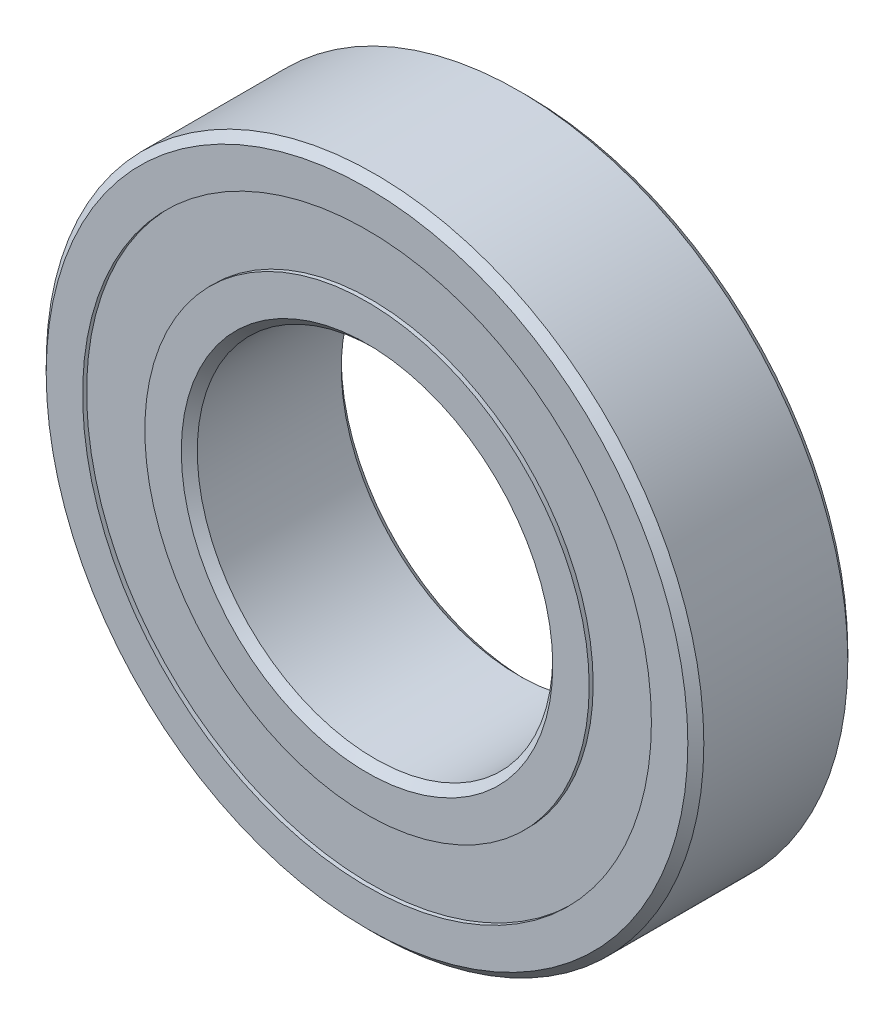
ISO-10303-21;
HEADER;
FILE_DESCRIPTION(('STEP AP214'),'2;1');
FILE_NAME('part.step','',(''),(''),'','','');
FILE_SCHEMA(('AUTOMOTIVE_DESIGN { 1 0 10303 214 1 1 1 1 }'));
ENDSEC;
DATA;
#1=APPLICATION_CONTEXT('core data for automotive mechanical design processes');
#2=APPLICATION_PROTOCOL_DEFINITION('international standard','automotive_design',2000,#1);
#3=PRODUCT_CONTEXT('',#1,'mechanical');
#4=PRODUCT('Part','Part','',(#3));
#5=PRODUCT_RELATED_PRODUCT_CATEGORY('part','',(#4));
#6=PRODUCT_DEFINITION_FORMATION('','',#4);
#7=PRODUCT_DEFINITION_CONTEXT('part definition',#1,'design');
#8=PRODUCT_DEFINITION('design','',#6,#7);
#9=PRODUCT_DEFINITION_SHAPE('','',#8);
#10=(LENGTH_UNIT() NAMED_UNIT(*) SI_UNIT(.MILLI.,.METRE.));
#11=(NAMED_UNIT(*) PLANE_ANGLE_UNIT() SI_UNIT($,.RADIAN.));
#12=(NAMED_UNIT(*) SI_UNIT($,.STERADIAN.) SOLID_ANGLE_UNIT());
#13=UNCERTAINTY_MEASURE_WITH_UNIT(LENGTH_MEASURE(1.E-05),#10,'distance_accuracy_value','');
#14=(GEOMETRIC_REPRESENTATION_CONTEXT(3) GLOBAL_UNCERTAINTY_ASSIGNED_CONTEXT((#13)) GLOBAL_UNIT_ASSIGNED_CONTEXT((#10,
#11,#12)) REPRESENTATION_CONTEXT('',''));
#15=CARTESIAN_POINT('',(0.,0.,0.));
#16=DIRECTION('',(0.,0.,1.));
#17=DIRECTION('',(1.,0.,0.));
#18=AXIS2_PLACEMENT_3D('',#15,#16,#17);
#19=CARTESIAN_POINT('',(0.,16.,-4.275));
#20=DIRECTION('',(0.,0.,1.));
#21=DIRECTION('',(1.,0.,0.));
#22=AXIS2_PLACEMENT_3D('',#19,#20,#21);
#23=PLANE('',#22);
#24=CARTESIAN_POINT('',(0.,0.,-4.275));
#25=DIRECTION('',(0.,0.,1.));
#26=DIRECTION('',(1.,0.,0.));
#27=AXIS2_PLACEMENT_3D('',#24,#25,#26);
#28=CIRCLE('',#27,16.);
#29=CARTESIAN_POINT('',(16.,0.,-4.275));
#30=VERTEX_POINT('',#29);
#31=EDGE_CURVE('E59',#30,#30,#28,.T.);
#32=ORIENTED_EDGE('',*,*,#31,.F.);
#33=EDGE_LOOP('',(#32));
#34=FACE_BOUND('',#33,.T.);
#35=CARTESIAN_POINT('',(0.,0.,-4.275));
#36=DIRECTION('',(0.,0.,1.));
#37=DIRECTION('',(1.,0.,0.));
#38=AXIS2_PLACEMENT_3D('',#35,#36,#37);
#39=CIRCLE('',#38,12.5);
#40=CARTESIAN_POINT('',(12.5,0.,-4.275));
#41=VERTEX_POINT('',#40);
#42=EDGE_CURVE('E11',#41,#41,#39,.T.);
#43=ORIENTED_EDGE('',*,*,#42,.T.);
#44=EDGE_LOOP('',(#43));
#45=FACE_BOUND('',#44,.T.);
#46=ADVANCED_FACE('F45',(#34,#45),#23,.F.);
#47=CARTESIAN_POINT('',(0.,0.,4.5));
#48=DIRECTION('',(0.,0.,1.));
#49=DIRECTION('',(1.,0.,0.));
#50=AXIS2_PLACEMENT_3D('',#47,#48,#49);
#51=CYLINDRICAL_SURFACE('',#50,12.5);
#52=ORIENTED_EDGE('',*,*,#42,.F.);
#53=EDGE_LOOP('',(#52));
#54=FACE_BOUND('',#53,.T.);
#55=CARTESIAN_POINT('',(0.,0.,-2.65753645318366));
#56=DIRECTION('',(0.,0.,1.));
#57=DIRECTION('',(1.,0.,0.));
#58=AXIS2_PLACEMENT_3D('',#55,#56,#57);
#59=CIRCLE('',#58,12.5);
#60=CARTESIAN_POINT('',(12.5,0.,-2.65753645318366));
#61=VERTEX_POINT('',#60);
#62=EDGE_CURVE('E51',#61,#61,#59,.T.);
#63=ORIENTED_EDGE('',*,*,#62,.T.);
#64=EDGE_LOOP('',(#63));
#65=FACE_BOUND('',#64,.T.);
#66=ADVANCED_FACE('F68',(#54,#65),#51,.F.);
#67=CARTESIAN_POINT('',(0.,16.,-2.65753645318366));
#68=DIRECTION('',(0.,0.,-1.));
#69=DIRECTION('',(-1.,0.,0.));
#70=AXIS2_PLACEMENT_3D('',#67,#68,#69);
#71=PLANE('',#70);
#72=ORIENTED_EDGE('',*,*,#62,.F.);
#73=EDGE_LOOP('',(#72));
#74=FACE_BOUND('',#73,.T.);
#75=CARTESIAN_POINT('',(0.,0.,-2.65753645318366));
#76=DIRECTION('',(0.,0.,1.));
#77=DIRECTION('',(1.,0.,0.));
#78=AXIS2_PLACEMENT_3D('',#75,#76,#77);
#79=CIRCLE('',#78,16.);
#80=CARTESIAN_POINT('',(16.,0.,-2.65753645318366));
#81=VERTEX_POINT('',#80);
#82=EDGE_CURVE('E55',#81,#81,#79,.T.);
#83=ORIENTED_EDGE('',*,*,#82,.T.);
#84=EDGE_LOOP('',(#83));
#85=FACE_BOUND('',#84,.T.);
#86=ADVANCED_FACE('F72',(#74,#85),#71,.F.);
#87=CARTESIAN_POINT('',(0.,0.,4.5));
#88=DIRECTION('',(0.,0.,1.));
#89=DIRECTION('',(1.,0.,0.));
#90=AXIS2_PLACEMENT_3D('',#87,#88,#89);
#91=CYLINDRICAL_SURFACE('',#90,16.);
#92=ORIENTED_EDGE('',*,*,#82,.F.);
#93=EDGE_LOOP('',(#92));
#94=FACE_BOUND('',#93,.T.);
#95=ORIENTED_EDGE('',*,*,#31,.T.);
#96=EDGE_LOOP('',(#95));
#97=FACE_BOUND('',#96,.T.);
#98=ADVANCED_FACE('F65',(#94,#97),#91,.T.);
#99=CLOSED_SHELL('',(#46,#66,#86,#98));
#100=MANIFOLD_SOLID_BREP('B2',#99);
#101=CARTESIAN_POINT('',(0.,16.,4.275));
#102=DIRECTION('',(0.,0.,-1.));
#103=DIRECTION('',(-1.,0.,0.));
#104=AXIS2_PLACEMENT_3D('',#101,#102,#103);
#105=PLANE('',#104);
#106=CARTESIAN_POINT('',(0.,0.,4.275));
#107=DIRECTION('',(0.,0.,1.));
#108=DIRECTION('',(1.,0.,0.));
#109=AXIS2_PLACEMENT_3D('',#106,#107,#108);
#110=CIRCLE('',#109,12.5);
#111=CARTESIAN_POINT('',(12.5,0.,4.275));
#112=VERTEX_POINT('',#111);
#113=EDGE_CURVE('E44',#112,#112,#110,.T.);
#114=ORIENTED_EDGE('',*,*,#113,.F.);
#115=EDGE_LOOP('',(#114));
#116=FACE_BOUND('',#115,.T.);
#117=CARTESIAN_POINT('',(0.,0.,4.275));
#118=DIRECTION('',(0.,0.,1.));
#119=DIRECTION('',(1.,0.,0.));
#120=AXIS2_PLACEMENT_3D('',#117,#118,#119);
#121=CIRCLE('',#120,16.);
#122=CARTESIAN_POINT('',(16.,0.,4.275));
#123=VERTEX_POINT('',#122);
#124=EDGE_CURVE('E126',#123,#123,#121,.T.);
#125=ORIENTED_EDGE('',*,*,#124,.T.);
#126=EDGE_LOOP('',(#125));
#127=FACE_BOUND('',#126,.T.);
#128=ADVANCED_FACE('F112',(#116,#127),#105,.F.);
#129=CARTESIAN_POINT('',(0.,0.,4.5));
#130=DIRECTION('',(0.,0.,1.));
#131=DIRECTION('',(1.,0.,0.));
#132=AXIS2_PLACEMENT_3D('',#129,#130,#131);
#133=CYLINDRICAL_SURFACE('',#132,12.5);
#134=CARTESIAN_POINT('',(0.,0.,2.65753645318366));
#135=DIRECTION('',(0.,0.,1.));
#136=DIRECTION('',(1.,0.,0.));
#137=AXIS2_PLACEMENT_3D('',#134,#135,#136);
#138=CIRCLE('',#137,12.5);
#139=CARTESIAN_POINT('',(12.5,0.,2.65753645318366));
#140=VERTEX_POINT('',#139);
#141=EDGE_CURVE('E118',#140,#140,#138,.T.);
#142=ORIENTED_EDGE('',*,*,#141,.F.);
#143=EDGE_LOOP('',(#142));
#144=FACE_BOUND('',#143,.T.);
#145=ORIENTED_EDGE('',*,*,#113,.T.);
#146=EDGE_LOOP('',(#145));
#147=FACE_BOUND('',#146,.T.);
#148=ADVANCED_FACE('F141',(#144,#147),#133,.F.);
#149=CARTESIAN_POINT('',(0.,16.,2.65753645318366));
#150=DIRECTION('',(0.,0.,1.));
#151=DIRECTION('',(1.,0.,0.));
#152=AXIS2_PLACEMENT_3D('',#149,#150,#151);
#153=PLANE('',#152);
#154=CARTESIAN_POINT('',(0.,0.,2.65753645318366));
#155=DIRECTION('',(0.,0.,1.));
#156=DIRECTION('',(1.,0.,0.));
#157=AXIS2_PLACEMENT_3D('',#154,#155,#156);
#158=CIRCLE('',#157,16.);
#159=CARTESIAN_POINT('',(16.,0.,2.65753645318366));
#160=VERTEX_POINT('',#159);
#161=EDGE_CURVE('E122',#160,#160,#158,.T.);
#162=ORIENTED_EDGE('',*,*,#161,.F.);
#163=EDGE_LOOP('',(#162));
#164=FACE_BOUND('',#163,.T.);
#165=ORIENTED_EDGE('',*,*,#141,.T.);
#166=EDGE_LOOP('',(#165));
#167=FACE_BOUND('',#166,.T.);
#168=ADVANCED_FACE('F136',(#164,#167),#153,.F.);
#169=CARTESIAN_POINT('',(0.,0.,4.5));
#170=DIRECTION('',(0.,0.,1.));
#171=DIRECTION('',(1.,0.,0.));
#172=AXIS2_PLACEMENT_3D('',#169,#170,#171);
#173=CYLINDRICAL_SURFACE('',#172,16.);
#174=ORIENTED_EDGE('',*,*,#124,.F.);
#175=EDGE_LOOP('',(#174));
#176=FACE_BOUND('',#175,.T.);
#177=ORIENTED_EDGE('',*,*,#161,.T.);
#178=EDGE_LOOP('',(#177));
#179=FACE_BOUND('',#178,.T.);
#180=ADVANCED_FACE('F133',(#176,#179),#173,.T.);
#181=CLOSED_SHELL('',(#128,#148,#168,#180));
#182=MANIFOLD_SOLID_BREP('B6',#181);
#183=CARTESIAN_POINT('',(-7.7041316487421,11.9878628428444,0.));
#184=DIRECTION('',(0.,0.,1.));
#185=DIRECTION('',(-0.540640817455586,0.841253532831188,0.));
#186=AXIS2_PLACEMENT_3D('',#183,#184,#185);
#187=SPHERICAL_SURFACE('',#186,2.65753645318366);
#188=CARTESIAN_POINT('',(-7.7041316487421,11.9878628428444,2.65753645318366));
#189=VERTEX_POINT('',#188);
#190=VERTEX_LOOP('',#189);
#191=FACE_BOUND('',#190,.T.);
#192=ADVANCED_FACE('F179',(#191),#187,.T.);
#193=CLOSED_SHELL('',(#192));
#194=MANIFOLD_SOLID_BREP('B39',#193);
#195=CARTESIAN_POINT('',(-12.9622559338018,5.91966393527704,0.));
#196=DIRECTION('',(0.,0.,1.));
#197=DIRECTION('',(-0.909631995354513,0.415415013001897,0.));
#198=AXIS2_PLACEMENT_3D('',#195,#196,#197);
#199=SPHERICAL_SURFACE('',#198,2.65753645318366);
#200=CARTESIAN_POINT('',(-12.9622559338018,5.91966393527704,2.65753645318366));
#201=VERTEX_POINT('',#200);
#202=VERTEX_LOOP('',#201);
#203=FACE_BOUND('',#202,.T.);
#204=ADVANCED_FACE('F199',(#203),#199,.T.);
#205=CLOSED_SHELL('',(#204));
#206=MANIFOLD_SOLID_BREP('B108',#205);
#207=CARTESIAN_POINT('',(-14.1049555468033,-2.02798644539416,0.));
#208=DIRECTION('',(0.,0.,1.));
#209=DIRECTION('',(-0.989821441880934,-0.142314838273275,0.));
#210=AXIS2_PLACEMENT_3D('',#207,#208,#209);
#211=SPHERICAL_SURFACE('',#210,2.65753645318366);
#212=CARTESIAN_POINT('',(-14.1049555468033,-2.02798644539416,2.65753645318366));
#213=VERTEX_POINT('',#212);
#214=VERTEX_LOOP('',#213);
#215=FACE_BOUND('',#214,.T.);
#216=ADVANCED_FACE('F219',(#215),#211,.T.);
#217=CLOSED_SHELL('',(#216));
#218=MANIFOLD_SOLID_BREP('B175',#217);
#219=CARTESIAN_POINT('',(-10.7694314345483,-9.33176545872021,0.));
#220=DIRECTION('',(0.,0.,1.));
#221=DIRECTION('',(-0.755749574354264,-0.654860733945278,0.));
#222=AXIS2_PLACEMENT_3D('',#219,#220,#221);
#223=SPHERICAL_SURFACE('',#222,2.65753645318366);
#224=CARTESIAN_POINT('',(-10.7694314345483,-9.33176545872021,2.65753645318366));
#225=VERTEX_POINT('',#224);
#226=VERTEX_LOOP('',#225);
#227=FACE_BOUND('',#226,.T.);
#228=ADVANCED_FACE('F239',(#227),#223,.T.);
#229=CLOSED_SHELL('',(#228));
#230=MANIFOLD_SOLID_BREP('B195',#229);
#231=CARTESIAN_POINT('',(-4.01468893499048,-13.6727748740066,0.));
#232=DIRECTION('',(0.,0.,1.));
#233=DIRECTION('',(-0.281732556841437,-0.959492973614495,0.));
#234=AXIS2_PLACEMENT_3D('',#231,#232,#233);
#235=SPHERICAL_SURFACE('',#234,2.65753645318366);
#236=CARTESIAN_POINT('',(-4.01468893499048,-13.6727748740066,2.65753645318366));
#237=VERTEX_POINT('',#236);
#238=VERTEX_LOOP('',#237);
#239=FACE_BOUND('',#238,.T.);
#240=ADVANCED_FACE('F259',(#239),#235,.T.);
#241=CLOSED_SHELL('',(#240));
#242=MANIFOLD_SOLID_BREP('B215',#241);
#243=CARTESIAN_POINT('',(4.01468893499028,-13.6727748740066,0.));
#244=DIRECTION('',(0.,0.,1.));
#245=DIRECTION('',(0.281732556841423,-0.959492973614499,0.));
#246=AXIS2_PLACEMENT_3D('',#243,#244,#245);
#247=SPHERICAL_SURFACE('',#246,2.65753645318366);
#248=CARTESIAN_POINT('',(4.01468893499028,-13.6727748740066,2.65753645318366));
#249=VERTEX_POINT('',#248);
#250=VERTEX_LOOP('',#249);
#251=FACE_BOUND('',#250,.T.);
#252=ADVANCED_FACE('F279',(#251),#247,.T.);
#253=CLOSED_SHELL('',(#252));
#254=MANIFOLD_SOLID_BREP('B235',#253);
#255=CARTESIAN_POINT('',(10.7694314345481,-9.33176545872037,0.));
#256=DIRECTION('',(0.,0.,1.));
#257=DIRECTION('',(0.755749574354255,-0.654860733945289,0.));
#258=AXIS2_PLACEMENT_3D('',#255,#256,#257);
#259=SPHERICAL_SURFACE('',#258,2.65753645318366);
#260=CARTESIAN_POINT('',(10.7694314345481,-9.33176545872037,2.65753645318366));
#261=VERTEX_POINT('',#260);
#262=VERTEX_LOOP('',#261);
#263=FACE_BOUND('',#262,.T.);
#264=ADVANCED_FACE('F299',(#263),#259,.T.);
#265=CLOSED_SHELL('',(#264));
#266=MANIFOLD_SOLID_BREP('B255',#265);
#267=CARTESIAN_POINT('',(14.1049555468033,-2.02798644539437,0.));
#268=DIRECTION('',(0.,0.,1.));
#269=DIRECTION('',(0.989821441880932,-0.142314838273289,0.));
#270=AXIS2_PLACEMENT_3D('',#267,#268,#269);
#271=SPHERICAL_SURFACE('',#270,2.65753645318366);
#272=CARTESIAN_POINT('',(14.1049555468033,-2.02798644539437,2.65753645318366));
#273=VERTEX_POINT('',#272);
#274=VERTEX_LOOP('',#273);
#275=FACE_BOUND('',#274,.T.);
#276=ADVANCED_FACE('F319',(#275),#271,.T.);
#277=CLOSED_SHELL('',(#276));
#278=MANIFOLD_SOLID_BREP('B275',#277);
#279=CARTESIAN_POINT('',(12.9622559338019,5.91966393527685,0.));
#280=DIRECTION('',(0.,0.,1.));
#281=DIRECTION('',(0.909631995354519,0.415415013001884,0.));
#282=AXIS2_PLACEMENT_3D('',#279,#280,#281);
#283=SPHERICAL_SURFACE('',#282,2.65753645318366);
#284=CARTESIAN_POINT('',(12.9622559338019,5.91966393527685,2.65753645318366));
#285=VERTEX_POINT('',#284);
#286=VERTEX_LOOP('',#285);
#287=FACE_BOUND('',#286,.T.);
#288=ADVANCED_FACE('F339',(#287),#283,.T.);
#289=CLOSED_SHELL('',(#288));
#290=MANIFOLD_SOLID_BREP('B295',#289);
#291=CARTESIAN_POINT('',(7.70413164874228,11.9878628428443,0.));
#292=DIRECTION('',(0.,0.,1.));
#293=DIRECTION('',(0.540640817455599,0.841253532831181,0.));
#294=AXIS2_PLACEMENT_3D('',#291,#292,#293);
#295=SPHERICAL_SURFACE('',#294,2.65753645318366);
#296=CARTESIAN_POINT('',(7.70413164874228,11.9878628428443,2.65753645318366));
#297=VERTEX_POINT('',#296);
#298=VERTEX_LOOP('',#297);
#299=FACE_BOUND('',#298,.T.);
#300=ADVANCED_FACE('F359',(#299),#295,.T.);
#301=CLOSED_SHELL('',(#300));
#302=MANIFOLD_SOLID_BREP('B315',#301);
#303=CARTESIAN_POINT('',(0.,14.25,0.));
#304=DIRECTION('',(0.,0.,1.));
#305=DIRECTION('',(0.,1.,0.));
#306=AXIS2_PLACEMENT_3D('',#303,#304,#305);
#307=SPHERICAL_SURFACE('',#306,2.65753645318366);
#308=CARTESIAN_POINT('',(0.,14.25,2.65753645318366));
#309=VERTEX_POINT('',#308);
#310=VERTEX_LOOP('',#309);
#311=FACE_BOUND('',#310,.T.);
#312=ADVANCED_FACE('F381',(#311),#307,.T.);
#313=CLOSED_SHELL('',(#312));
#314=MANIFOLD_SOLID_BREP('B335',#313);
#315=CARTESIAN_POINT('',(0.,0.,4.5));
#316=DIRECTION('',(0.,0.,1.));
#317=DIRECTION('',(1.,0.,0.));
#318=AXIS2_PLACEMENT_3D('',#315,#316,#317);
#319=CONICAL_SURFACE('',#318,10.45,0.785398163397449);
#320=CARTESIAN_POINT('',(0.,0.,4.05));
#321=DIRECTION('',(0.,0.,1.));
#322=DIRECTION('',(1.,0.,0.));
#323=AXIS2_PLACEMENT_3D('',#320,#321,#322);
#324=CIRCLE('',#323,10.);
#325=CARTESIAN_POINT('',(10.,0.,4.05));
#326=VERTEX_POINT('',#325);
#327=EDGE_CURVE('E380',#326,#326,#324,.T.);
#328=ORIENTED_EDGE('',*,*,#327,.F.);
#329=EDGE_LOOP('',(#328));
#330=FACE_BOUND('',#329,.T.);
#331=CARTESIAN_POINT('',(0.,0.,4.5));
#332=DIRECTION('',(0.,0.,1.));
#333=DIRECTION('',(1.,0.,0.));
#334=AXIS2_PLACEMENT_3D('',#331,#332,#333);
#335=CIRCLE('',#334,10.45);
#336=CARTESIAN_POINT('',(10.45,0.,4.5));
#337=VERTEX_POINT('',#336);
#338=EDGE_CURVE('E428',#337,#337,#335,.T.);
#339=ORIENTED_EDGE('',*,*,#338,.T.);
#340=EDGE_LOOP('',(#339));
#341=FACE_BOUND('',#340,.T.);
#342=ADVANCED_FACE('F400',(#330,#341),#319,.F.);
#343=CARTESIAN_POINT('',(0.,0.,4.5));
#344=DIRECTION('',(0.,0.,1.));
#345=DIRECTION('',(1.,0.,0.));
#346=AXIS2_PLACEMENT_3D('',#343,#344,#345);
#347=CYLINDRICAL_SURFACE('',#346,10.);
#348=CARTESIAN_POINT('',(0.,0.,-4.05));
#349=DIRECTION('',(0.,0.,1.));
#350=DIRECTION('',(1.,0.,0.));
#351=AXIS2_PLACEMENT_3D('',#348,#349,#350);
#352=CIRCLE('',#351,10.);
#353=CARTESIAN_POINT('',(10.,0.,-4.05));
#354=VERTEX_POINT('',#353);
#355=EDGE_CURVE('E406',#354,#354,#352,.T.);
#356=ORIENTED_EDGE('',*,*,#355,.F.);
#357=EDGE_LOOP('',(#356));
#358=FACE_BOUND('',#357,.T.);
#359=ORIENTED_EDGE('',*,*,#327,.T.);
#360=EDGE_LOOP('',(#359));
#361=FACE_BOUND('',#360,.T.);
#362=ADVANCED_FACE('F465',(#358,#361),#347,.F.);
#363=CARTESIAN_POINT('',(0.,0.,-4.05));
#364=DIRECTION('',(0.,0.,-1.));
#365=DIRECTION('',(-1.,0.,0.));
#366=AXIS2_PLACEMENT_3D('',#363,#364,#365);
#367=CONICAL_SURFACE('',#366,10.,0.78539816339745);
#368=CARTESIAN_POINT('',(0.,0.,-4.5));
#369=DIRECTION('',(0.,0.,1.));
#370=DIRECTION('',(1.,0.,0.));
#371=AXIS2_PLACEMENT_3D('',#368,#369,#370);
#372=CIRCLE('',#371,10.45);
#373=CARTESIAN_POINT('',(10.45,0.,-4.5));
#374=VERTEX_POINT('',#373);
#375=EDGE_CURVE('E410',#374,#374,#372,.T.);
#376=ORIENTED_EDGE('',*,*,#375,.F.);
#377=EDGE_LOOP('',(#376));
#378=FACE_BOUND('',#377,.T.);
#379=ORIENTED_EDGE('',*,*,#355,.T.);
#380=EDGE_LOOP('',(#379));
#381=FACE_BOUND('',#380,.T.);
#382=ADVANCED_FACE('F460',(#378,#381),#367,.F.);
#383=CARTESIAN_POINT('',(0.,10.45,-4.5));
#384=DIRECTION('',(0.,0.,1.));
#385=DIRECTION('',(1.,0.,0.));
#386=AXIS2_PLACEMENT_3D('',#383,#384,#385);
#387=PLANE('',#386);
#388=CARTESIAN_POINT('',(0.,0.,-4.5));
#389=DIRECTION('',(0.,0.,1.));
#390=DIRECTION('',(1.,0.,0.));
#391=AXIS2_PLACEMENT_3D('',#388,#389,#390);
#392=CIRCLE('',#391,12.5);
#393=CARTESIAN_POINT('',(12.5,0.,-4.5));
#394=VERTEX_POINT('',#393);
#395=EDGE_CURVE('E414',#394,#394,#392,.T.);
#396=ORIENTED_EDGE('',*,*,#395,.F.);
#397=EDGE_LOOP('',(#396));
#398=FACE_BOUND('',#397,.T.);
#399=ORIENTED_EDGE('',*,*,#375,.T.);
#400=EDGE_LOOP('',(#399));
#401=FACE_BOUND('',#400,.T.);
#402=ADVANCED_FACE('F454',(#398,#401),#387,.F.);
#403=CARTESIAN_POINT('',(0.,0.,4.5));
#404=DIRECTION('',(0.,0.,1.));
#405=DIRECTION('',(1.,0.,0.));
#406=AXIS2_PLACEMENT_3D('',#403,#404,#405);
#407=CYLINDRICAL_SURFACE('',#406,12.5);
#408=CARTESIAN_POINT('',(0.,0.,-2.));
#409=DIRECTION('',(0.,0.,1.));
#410=DIRECTION('',(1.,0.,0.));
#411=AXIS2_PLACEMENT_3D('',#408,#409,#410);
#412=CIRCLE('',#411,12.5);
#413=CARTESIAN_POINT('',(12.5,0.,-2.));
#414=VERTEX_POINT('',#413);
#415=EDGE_CURVE('E419',#414,#414,#412,.T.);
#416=ORIENTED_EDGE('',*,*,#415,.F.);
#417=EDGE_LOOP('',(#416));
#418=FACE_BOUND('',#417,.T.);
#419=ORIENTED_EDGE('',*,*,#395,.T.);
#420=EDGE_LOOP('',(#419));
#421=FACE_BOUND('',#420,.T.);
#422=ADVANCED_FACE('F448',(#418,#421),#407,.T.);
#423=CARTESIAN_POINT('',(0.,0.,0.));
#424=DIRECTION('',(0.,0.,1.));
#425=DIRECTION('',(1.,0.,0.));
#426=AXIS2_PLACEMENT_3D('',#423,#424,#425);
#427=TOROIDAL_SURFACE('',#426,14.25,2.65753645318366);
#428=CARTESIAN_POINT('',(0.,0.,2.));
#429=DIRECTION('',(0.,0.,1.));
#430=DIRECTION('',(1.,0.,0.));
#431=AXIS2_PLACEMENT_3D('',#428,#429,#430);
#432=CIRCLE('',#431,12.5);
#433=CARTESIAN_POINT('',(12.5,0.,2.));
#434=VERTEX_POINT('',#433);
#435=EDGE_CURVE('E422',#434,#434,#432,.T.);
#436=ORIENTED_EDGE('',*,*,#435,.F.);
#437=EDGE_LOOP('',(#436));
#438=FACE_BOUND('',#437,.T.);
#439=ORIENTED_EDGE('',*,*,#415,.T.);
#440=EDGE_LOOP('',(#439));
#441=FACE_BOUND('',#440,.T.);
#442=ADVANCED_FACE('F442',(#438,#441),#427,.F.);
#443=CARTESIAN_POINT('',(0.,0.,4.5));
#444=DIRECTION('',(0.,0.,1.));
#445=DIRECTION('',(1.,0.,0.));
#446=AXIS2_PLACEMENT_3D('',#443,#444,#445);
#447=CYLINDRICAL_SURFACE('',#446,12.5);
#448=CARTESIAN_POINT('',(0.,0.,4.5));
#449=DIRECTION('',(0.,0.,1.));
#450=DIRECTION('',(1.,0.,0.));
#451=AXIS2_PLACEMENT_3D('',#448,#449,#450);
#452=CIRCLE('',#451,12.5);
#453=CARTESIAN_POINT('',(12.5,0.,4.5));
#454=VERTEX_POINT('',#453);
#455=EDGE_CURVE('E425',#454,#454,#452,.T.);
#456=ORIENTED_EDGE('',*,*,#455,.F.);
#457=EDGE_LOOP('',(#456));
#458=FACE_BOUND('',#457,.T.);
#459=ORIENTED_EDGE('',*,*,#435,.T.);
#460=EDGE_LOOP('',(#459));
#461=FACE_BOUND('',#460,.T.);
#462=ADVANCED_FACE('F436',(#458,#461),#447,.T.);
#463=CARTESIAN_POINT('',(0.,10.45,4.5));
#464=DIRECTION('',(0.,0.,-1.));
#465=DIRECTION('',(-1.,0.,0.));
#466=AXIS2_PLACEMENT_3D('',#463,#464,#465);
#467=PLANE('',#466);
#468=ORIENTED_EDGE('',*,*,#338,.F.);
#469=EDGE_LOOP('',(#468));
#470=FACE_BOUND('',#469,.T.);
#471=ORIENTED_EDGE('',*,*,#455,.T.);
#472=EDGE_LOOP('',(#471));
#473=FACE_BOUND('',#472,.T.);
#474=ADVANCED_FACE('F433',(#470,#473),#467,.F.);
#475=CLOSED_SHELL('',(#342,#362,#382,#402,#422,#442,#462,#474));
#476=MANIFOLD_SOLID_BREP('B355',#475);
#477=CARTESIAN_POINT('',(0.,0.,4.05));
#478=DIRECTION('',(0.,0.,-1.));
#479=DIRECTION('',(-1.,0.,0.));
#480=AXIS2_PLACEMENT_3D('',#477,#478,#479);
#481=CONICAL_SURFACE('',#480,18.5,0.785398163397451);
#482=CARTESIAN_POINT('',(0.,0.,4.5));
#483=DIRECTION('',(0.,0.,1.));
#484=DIRECTION('',(1.,0.,0.));
#485=AXIS2_PLACEMENT_3D('',#482,#483,#484);
#486=CIRCLE('',#485,18.05);
#487=CARTESIAN_POINT('',(18.05,0.,4.5));
#488=VERTEX_POINT('',#487);
#489=EDGE_CURVE('E399',#488,#488,#486,.T.);
#490=ORIENTED_EDGE('',*,*,#489,.F.);
#491=EDGE_LOOP('',(#490));
#492=FACE_BOUND('',#491,.T.);
#493=CARTESIAN_POINT('',(0.,0.,4.05));
#494=DIRECTION('',(0.,0.,1.));
#495=DIRECTION('',(1.,0.,0.));
#496=AXIS2_PLACEMENT_3D('',#493,#494,#495);
#497=CIRCLE('',#496,18.5);
#498=CARTESIAN_POINT('',(18.5,0.,4.05));
#499=VERTEX_POINT('',#498);
#500=EDGE_CURVE('E549',#499,#499,#497,.T.);
#501=ORIENTED_EDGE('',*,*,#500,.T.);
#502=EDGE_LOOP('',(#501));
#503=FACE_BOUND('',#502,.T.);
#504=ADVANCED_FACE('F521',(#492,#503),#481,.T.);
#505=CARTESIAN_POINT('',(0.,18.05,4.5));
#506=DIRECTION('',(0.,0.,-1.));
#507=DIRECTION('',(-1.,0.,0.));
#508=AXIS2_PLACEMENT_3D('',#505,#506,#507);
#509=PLANE('',#508);
#510=CARTESIAN_POINT('',(0.,0.,4.5));
#511=DIRECTION('',(0.,0.,1.));
#512=DIRECTION('',(1.,0.,0.));
#513=AXIS2_PLACEMENT_3D('',#510,#511,#512);
#514=CIRCLE('',#513,16.);
#515=CARTESIAN_POINT('',(16.,0.,4.5));
#516=VERTEX_POINT('',#515);
#517=EDGE_CURVE('E527',#516,#516,#514,.T.);
#518=ORIENTED_EDGE('',*,*,#517,.F.);
#519=EDGE_LOOP('',(#518));
#520=FACE_BOUND('',#519,.T.);
#521=ORIENTED_EDGE('',*,*,#489,.T.);
#522=EDGE_LOOP('',(#521));
#523=FACE_BOUND('',#522,.T.);
#524=ADVANCED_FACE('F586',(#520,#523),#509,.F.);
#525=CARTESIAN_POINT('',(0.,0.,4.5));
#526=DIRECTION('',(0.,0.,1.));
#527=DIRECTION('',(1.,0.,0.));
#528=AXIS2_PLACEMENT_3D('',#525,#526,#527);
#529=CYLINDRICAL_SURFACE('',#528,16.);
#530=CARTESIAN_POINT('',(0.,0.,2.));
#531=DIRECTION('',(0.,0.,1.));
#532=DIRECTION('',(1.,0.,0.));
#533=AXIS2_PLACEMENT_3D('',#530,#531,#532);
#534=CIRCLE('',#533,16.);
#535=CARTESIAN_POINT('',(16.,0.,2.));
#536=VERTEX_POINT('',#535);
#537=EDGE_CURVE('E531',#536,#536,#534,.T.);
#538=ORIENTED_EDGE('',*,*,#537,.F.);
#539=EDGE_LOOP('',(#538));
#540=FACE_BOUND('',#539,.T.);
#541=ORIENTED_EDGE('',*,*,#517,.T.);
#542=EDGE_LOOP('',(#541));
#543=FACE_BOUND('',#542,.T.);
#544=ADVANCED_FACE('F581',(#540,#543),#529,.F.);
#545=CARTESIAN_POINT('',(0.,0.,0.));
#546=DIRECTION('',(0.,0.,1.));
#547=DIRECTION('',(1.,0.,0.));
#548=AXIS2_PLACEMENT_3D('',#545,#546,#547);
#549=TOROIDAL_SURFACE('',#548,14.25,2.65753645318366);
#550=CARTESIAN_POINT('',(0.,0.,-2.));
#551=DIRECTION('',(0.,0.,1.));
#552=DIRECTION('',(1.,0.,0.));
#553=AXIS2_PLACEMENT_3D('',#550,#551,#552);
#554=CIRCLE('',#553,16.);
#555=CARTESIAN_POINT('',(16.,0.,-2.));
#556=VERTEX_POINT('',#555);
#557=EDGE_CURVE('E535',#556,#556,#554,.T.);
#558=ORIENTED_EDGE('',*,*,#557,.F.);
#559=EDGE_LOOP('',(#558));
#560=FACE_BOUND('',#559,.T.);
#561=ORIENTED_EDGE('',*,*,#537,.T.);
#562=EDGE_LOOP('',(#561));
#563=FACE_BOUND('',#562,.T.);
#564=ADVANCED_FACE('F575',(#560,#563),#549,.F.);
#565=CARTESIAN_POINT('',(0.,0.,4.5));
#566=DIRECTION('',(0.,0.,1.));
#567=DIRECTION('',(1.,0.,0.));
#568=AXIS2_PLACEMENT_3D('',#565,#566,#567);
#569=CYLINDRICAL_SURFACE('',#568,16.);
#570=CARTESIAN_POINT('',(0.,0.,-4.5));
#571=DIRECTION('',(0.,0.,1.));
#572=DIRECTION('',(1.,0.,0.));
#573=AXIS2_PLACEMENT_3D('',#570,#571,#572);
#574=CIRCLE('',#573,16.);
#575=CARTESIAN_POINT('',(16.,0.,-4.5));
#576=VERTEX_POINT('',#575);
#577=EDGE_CURVE('E540',#576,#576,#574,.T.);
#578=ORIENTED_EDGE('',*,*,#577,.F.);
#579=EDGE_LOOP('',(#578));
#580=FACE_BOUND('',#579,.T.);
#581=ORIENTED_EDGE('',*,*,#557,.T.);
#582=EDGE_LOOP('',(#581));
#583=FACE_BOUND('',#582,.T.);
#584=ADVANCED_FACE('F569',(#580,#583),#569,.F.);
#585=CARTESIAN_POINT('',(0.,18.05,-4.5));
#586=DIRECTION('',(0.,0.,1.));
#587=DIRECTION('',(1.,0.,0.));
#588=AXIS2_PLACEMENT_3D('',#585,#586,#587);
#589=PLANE('',#588);
#590=CARTESIAN_POINT('',(0.,0.,-4.5));
#591=DIRECTION('',(0.,0.,1.));
#592=DIRECTION('',(1.,0.,0.));
#593=AXIS2_PLACEMENT_3D('',#590,#591,#592);
#594=CIRCLE('',#593,18.05);
#595=CARTESIAN_POINT('',(18.05,0.,-4.5));
#596=VERTEX_POINT('',#595);
#597=EDGE_CURVE('E543',#596,#596,#594,.T.);
#598=ORIENTED_EDGE('',*,*,#597,.F.);
#599=EDGE_LOOP('',(#598));
#600=FACE_BOUND('',#599,.T.);
#601=ORIENTED_EDGE('',*,*,#577,.T.);
#602=EDGE_LOOP('',(#601));
#603=FACE_BOUND('',#602,.T.);
#604=ADVANCED_FACE('F563',(#600,#603),#589,.F.);
#605=CARTESIAN_POINT('',(0.,0.,-4.5));
#606=DIRECTION('',(0.,0.,1.));
#607=DIRECTION('',(1.,0.,0.));
#608=AXIS2_PLACEMENT_3D('',#605,#606,#607);
#609=CONICAL_SURFACE('',#608,18.05,0.785398163397452);
#610=CARTESIAN_POINT('',(0.,0.,-4.05));
#611=DIRECTION('',(0.,0.,1.));
#612=DIRECTION('',(1.,0.,0.));
#613=AXIS2_PLACEMENT_3D('',#610,#611,#612);
#614=CIRCLE('',#613,18.5);
#615=CARTESIAN_POINT('',(18.5,0.,-4.05));
#616=VERTEX_POINT('',#615);
#617=EDGE_CURVE('E546',#616,#616,#614,.T.);
#618=ORIENTED_EDGE('',*,*,#617,.F.);
#619=EDGE_LOOP('',(#618));
#620=FACE_BOUND('',#619,.T.);
#621=ORIENTED_EDGE('',*,*,#597,.T.);
#622=EDGE_LOOP('',(#621));
#623=FACE_BOUND('',#622,.T.);
#624=ADVANCED_FACE('F557',(#620,#623),#609,.T.);
#625=CARTESIAN_POINT('',(0.,0.,4.5));
#626=DIRECTION('',(0.,0.,1.));
#627=DIRECTION('',(1.,0.,0.));
#628=AXIS2_PLACEMENT_3D('',#625,#626,#627);
#629=CYLINDRICAL_SURFACE('',#628,18.5);
#630=ORIENTED_EDGE('',*,*,#500,.F.);
#631=EDGE_LOOP('',(#630));
#632=FACE_BOUND('',#631,.T.);
#633=ORIENTED_EDGE('',*,*,#617,.T.);
#634=EDGE_LOOP('',(#633));
#635=FACE_BOUND('',#634,.T.);
#636=ADVANCED_FACE('F554',(#632,#635),#629,.T.);
#637=CLOSED_SHELL('',(#504,#524,#544,#564,#584,#604,#624,#636));
#638=MANIFOLD_SOLID_BREP('B375',#637);
#639=ADVANCED_BREP_SHAPE_REPRESENTATION('',(#18,#100,#182,#194,#206,#218,#230,#242,#254,#266,
#278,#290,#302,#314,#476,#638),#14);
#640=SHAPE_DEFINITION_REPRESENTATION(#9,#639);
ENDSEC;
END-ISO-10303-21;
